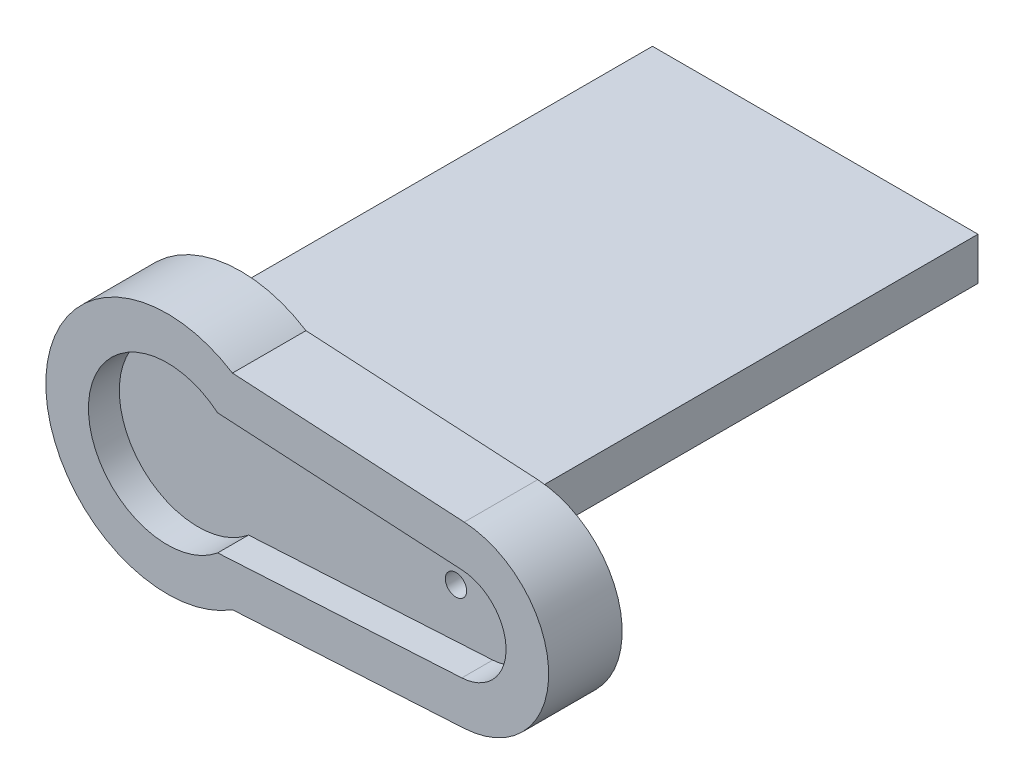
ISO-10303-21;
HEADER;
FILE_DESCRIPTION(('STEP AP214'),'2;1');
FILE_NAME('part.step','',(''),(''),'','','');
FILE_SCHEMA(('AUTOMOTIVE_DESIGN { 1 0 10303 214 1 1 1 1 }'));
ENDSEC;
DATA;
#1=APPLICATION_CONTEXT('core data for automotive mechanical design processes');
#2=APPLICATION_PROTOCOL_DEFINITION('international standard','automotive_design',2000,#1);
#3=PRODUCT_CONTEXT('',#1,'mechanical');
#4=PRODUCT('Part','Part','',(#3));
#5=PRODUCT_RELATED_PRODUCT_CATEGORY('part','',(#4));
#6=PRODUCT_DEFINITION_FORMATION('','',#4);
#7=PRODUCT_DEFINITION_CONTEXT('part definition',#1,'design');
#8=PRODUCT_DEFINITION('design','',#6,#7);
#9=PRODUCT_DEFINITION_SHAPE('','',#8);
#10=(LENGTH_UNIT() NAMED_UNIT(*) SI_UNIT(.MILLI.,.METRE.));
#11=(NAMED_UNIT(*) PLANE_ANGLE_UNIT() SI_UNIT($,.RADIAN.));
#12=(NAMED_UNIT(*) SI_UNIT($,.STERADIAN.) SOLID_ANGLE_UNIT());
#13=UNCERTAINTY_MEASURE_WITH_UNIT(LENGTH_MEASURE(1.E-05),#10,'distance_accuracy_value','');
#14=(GEOMETRIC_REPRESENTATION_CONTEXT(3) GLOBAL_UNCERTAINTY_ASSIGNED_CONTEXT((#13)) GLOBAL_UNIT_ASSIGNED_CONTEXT((#10,
#11,#12)) REPRESENTATION_CONTEXT('',''));
#15=CARTESIAN_POINT('',(0.,0.,0.));
#16=DIRECTION('',(0.,0.,1.));
#17=DIRECTION('',(1.,0.,0.));
#18=AXIS2_PLACEMENT_3D('',#15,#16,#17);
#19=CARTESIAN_POINT('',(13.7,0.,-3.45));
#20=DIRECTION('',(0.,0.,-1.));
#21=DIRECTION('',(-1.,0.,0.));
#22=AXIS2_PLACEMENT_3D('',#19,#20,#21);
#23=PLANE('',#22);
#24=CARTESIAN_POINT('',(0.,0.,-3.45));
#25=DIRECTION('',(0.,0.,-1.));
#26=DIRECTION('',(-1.,0.,0.));
#27=AXIS2_PLACEMENT_3D('',#24,#25,#26);
#28=CIRCLE('',#27,5.7);
#29=CARTESIAN_POINT('',(3.05879570208653,-4.80975767091202,-3.45));
#30=VERTEX_POINT('',#29);
#31=CARTESIAN_POINT('',(-3.49857113690718,-4.5,-3.45));
#32=VERTEX_POINT('',#31);
#33=EDGE_CURVE('E245',#30,#32,#28,.T.);
#34=ORIENTED_EDGE('',*,*,#33,.T.);
#35=CARTESIAN_POINT('',(10.3361249694973,-4.5,-3.45));
#36=CARTESIAN_POINT('',(4.93787519318368,-4.5,-3.45));
#37=CARTESIAN_POINT('',(-0.460374583129962,-4.5,-3.45));
#38=CARTESIAN_POINT('',(-5.8586243594436,-4.5,-3.45));
#39=(BOUNDED_CURVE() B_SPLINE_CURVE(3,(#35,#36,#37,#38),.UNSPECIFIED.,.F.,
.F.) B_SPLINE_CURVE_WITH_KNOTS((4,4),(-0.0103361249694973,0.0058586243594436),
.UNSPECIFIED.) CURVE() GEOMETRIC_REPRESENTATION_ITEM() RATIONAL_B_SPLINE_CURVE((1.,1.,1.,1.)) REPRESENTATION_ITEM(''));
#40=CARTESIAN_POINT('',(8.5249464707113,-4.5,-3.45));
#41=VERTEX_POINT('',#40);
#42=EDGE_CURVE('E73',#32,#41,#39,.F.);
#43=ORIENTED_EDGE('',*,*,#42,.T.);
#44=DIRECTION('',(-0.998398206670151,-0.0565775654992933,0.));
#45=VECTOR('',#44,1.);
#46=CARTESIAN_POINT('',(13.937625775097,-4.19327246801463,-3.45));
#47=LINE('',#46,#45);
#48=EDGE_CURVE('E235',#41,#30,#47,.T.);
#49=ORIENTED_EDGE('',*,*,#48,.T.);
#50=EDGE_LOOP('',(#34,#43,#49));
#51=FACE_BOUND('',#50,.T.);
#52=ADVANCED_FACE('F47',(#51),#23,.T.);
#53=CARTESIAN_POINT('',(12.1,0.,-3.45));
#54=DIRECTION('',(0.,0.,-1.));
#55=DIRECTION('',(-1.,0.,0.));
#56=AXIS2_PLACEMENT_3D('',#53,#54,#55);
#57=CIRCLE('',#56,0.500000000000001);
#58=CARTESIAN_POINT('',(11.6,0.,-3.45));
#59=VERTEX_POINT('',#58);
#60=EDGE_CURVE('E502',#59,#59,#57,.T.);
#61=ORIENTED_EDGE('',*,*,#60,.F.);
#62=EDGE_LOOP('',(#61));
#63=FACE_BOUND('',#62,.T.);
#64=CARTESIAN_POINT('',(13.937625775097,-4.19327246801463,-3.45));
#65=VERTEX_POINT('',#64);
#66=CARTESIAN_POINT('',(9.6,-4.43907850488691,-3.45));
#67=VERTEX_POINT('',#66);
#68=EDGE_CURVE('E224',#65,#67,#47,.T.);
#69=ORIENTED_EDGE('',*,*,#68,.T.);
#70=DIRECTION('',(0.,-1.,0.));
#71=VECTOR('',#70,1.);
#72=CARTESIAN_POINT('',(9.6,0.,-3.45));
#73=LINE('',#72,#71);
#74=CARTESIAN_POINT('',(9.6,-0.500000000000001,-3.45));
#75=VERTEX_POINT('',#74);
#76=EDGE_CURVE('E178',#75,#67,#73,.T.);
#77=ORIENTED_EDGE('',*,*,#76,.F.);
#78=DIRECTION('',(-1.,0.,0.));
#79=VECTOR('',#78,1.);
#80=CARTESIAN_POINT('',(0.,-0.500000000000001,-3.45));
#81=LINE('',#80,#79);
#82=CARTESIAN_POINT('',(-5.67802782663136,-0.500000000000001,-3.45));
#83=VERTEX_POINT('',#82);
#84=EDGE_CURVE('E161',#75,#83,#81,.T.);
#85=ORIENTED_EDGE('',*,*,#84,.T.);
#86=CARTESIAN_POINT('',(3.05879570208653,4.80975767091202,-3.45));
#87=VERTEX_POINT('',#86);
#88=EDGE_CURVE('E233',#83,#87,#28,.T.);
#89=ORIENTED_EDGE('',*,*,#88,.T.);
#90=DIRECTION('',(0.998398206670151,-0.0565775654992932,0.));
#91=VECTOR('',#90,1.);
#92=CARTESIAN_POINT('',(3.05879570208653,4.80975767091202,-3.45));
#93=LINE('',#92,#91);
#94=CARTESIAN_POINT('',(13.937625775097,4.19327246801463,-3.45));
#95=VERTEX_POINT('',#94);
#96=EDGE_CURVE('E246',#87,#95,#93,.T.);
#97=ORIENTED_EDGE('',*,*,#96,.T.);
#98=CARTESIAN_POINT('',(13.7,0.,-3.45));
#99=DIRECTION('',(0.,0.,-1.));
#100=DIRECTION('',(-1.,0.,0.));
#101=AXIS2_PLACEMENT_3D('',#98,#99,#100);
#102=CIRCLE('',#101,4.2);
#103=EDGE_CURVE('E240',#95,#65,#102,.T.);
#104=ORIENTED_EDGE('',*,*,#103,.T.);
#105=EDGE_LOOP('',(#69,#77,#85,#89,#97,#104));
#106=FACE_BOUND('',#105,.T.);
#107=ADVANCED_FACE('F253',(#63,#106),#23,.T.);
#108=CARTESIAN_POINT('',(0.281479761671259,-4.96714354508656,-27.6591587045445));
#109=DIRECTION('',(0.0565775654992933,-0.998398206670151,0.));
#110=DIRECTION('',(0.998398206670151,0.0565775654992933,0.));
#111=AXIS2_PLACEMENT_3D('',#108,#109,#110);
#112=PLANE('',#111);
#113=DIRECTION('',(0.,0.,1.));
#114=VECTOR('',#113,1.);
#115=CARTESIAN_POINT('',(3.05879570208653,-4.80975767091202,-27.6591587045445));
#116=LINE('',#115,#114);
#117=CARTESIAN_POINT('',(3.05879570208653,-4.80975767091202,0.));
#118=VERTEX_POINT('',#117);
#119=EDGE_CURVE('E470',#30,#118,#116,.T.);
#120=ORIENTED_EDGE('',*,*,#119,.F.);
#121=ORIENTED_EDGE('',*,*,#48,.F.);
#122=CARTESIAN_POINT('',(26.0199982000403,-3.50858452217087,-3.45));
#123=CARTESIAN_POINT('',(20.3112960784589,-3.83208717476614,-3.45000000000497));
#124=CARTESIAN_POINT('',(14.4183428523395,-4.16603103093047,-3.44999999999231));
#125=CARTESIAN_POINT('',(8.52494647071106,-4.50000000000001,-3.45));
#126=(BOUNDED_CURVE() B_SPLINE_CURVE(3,(#122,#123,#124,#125),.UNSPECIFIED.,.F.,
.F.) B_SPLINE_CURVE_WITH_KNOTS((4,4),(4.46151413081848,4.71238898038469),
.UNSPECIFIED.) CURVE() GEOMETRIC_REPRESENTATION_ITEM() RATIONAL_B_SPLINE_CURVE((1.,1.,1.,1.)) REPRESENTATION_ITEM(''));
#127=EDGE_CURVE('E234',#67,#41,#126,.T.);
#128=ORIENTED_EDGE('',*,*,#127,.F.);
#129=ORIENTED_EDGE('',*,*,#68,.F.);
#130=DIRECTION('',(0.,0.,1.));
#131=VECTOR('',#130,1.);
#132=CARTESIAN_POINT('',(13.937625775097,-4.19327246801463,-27.6591587045445));
#133=LINE('',#132,#131);
#134=CARTESIAN_POINT('',(13.937625775097,-4.19327246801463,0.));
#135=VERTEX_POINT('',#134);
#136=EDGE_CURVE('E473',#65,#135,#133,.T.);
#137=ORIENTED_EDGE('',*,*,#136,.T.);
#138=DIRECTION('',(0.998398206670151,0.0565775654992933,0.));
#139=VECTOR('',#138,1.);
#140=CARTESIAN_POINT('',(0.281479761671259,-4.96714354508656,0.));
#141=LINE('',#140,#139);
#142=EDGE_CURVE('E449',#118,#135,#141,.T.);
#143=ORIENTED_EDGE('',*,*,#142,.F.);
#144=EDGE_LOOP('',(#120,#121,#128,#129,#137,#143));
#145=FACE_BOUND('',#144,.T.);
#146=ADVANCED_FACE('F263',(#145),#112,.T.);
#147=CARTESIAN_POINT('',(0.,0.,-27.6591587045445));
#148=DIRECTION('',(0.,0.,1.));
#149=DIRECTION('',(1.,0.,0.));
#150=AXIS2_PLACEMENT_3D('',#147,#148,#149);
#151=CYLINDRICAL_SURFACE('',#150,5.7);
#152=DIRECTION('',(0.,0.,1.));
#153=VECTOR('',#152,1.);
#154=CARTESIAN_POINT('',(3.05879570208653,4.80975767091202,-27.6591587045445));
#155=LINE('',#154,#153);
#156=CARTESIAN_POINT('',(3.05879570208653,4.80975767091202,0.));
#157=VERTEX_POINT('',#156);
#158=EDGE_CURVE('E472',#87,#157,#155,.T.);
#159=ORIENTED_EDGE('',*,*,#158,.F.);
#160=ORIENTED_EDGE('',*,*,#88,.F.);
#161=DIRECTION('',(0.,0.,1.));
#162=VECTOR('',#161,1.);
#163=CARTESIAN_POINT('',(-5.67802782663136,-0.500000000000001,-28.45));
#164=LINE('',#163,#162);
#165=CARTESIAN_POINT('',(-5.67802782663136,-0.500000000000001,-28.45));
#166=VERTEX_POINT('',#165);
#167=EDGE_CURVE('E183',#166,#83,#164,.T.);
#168=ORIENTED_EDGE('',*,*,#167,.F.);
#169=CARTESIAN_POINT('',(0.,0.,-28.45));
#170=DIRECTION('',(0.,0.,-1.));
#171=DIRECTION('',(-1.,0.,0.));
#172=AXIS2_PLACEMENT_3D('',#169,#170,#171);
#173=CIRCLE('',#172,5.7);
#174=CARTESIAN_POINT('',(-5.12249938994628,-2.5,-28.45));
#175=VERTEX_POINT('',#174);
#176=EDGE_CURVE('E176',#175,#166,#173,.T.);
#177=ORIENTED_EDGE('',*,*,#176,.F.);
#178=DIRECTION('',(0.,0.,1.));
#179=VECTOR('',#178,1.);
#180=CARTESIAN_POINT('',(-5.12249938994628,-2.5,-28.45));
#181=LINE('',#180,#179);
#182=CARTESIAN_POINT('',(-5.12249938994628,-2.5,-7.45));
#183=VERTEX_POINT('',#182);
#184=EDGE_CURVE('E187',#175,#183,#181,.T.);
#185=ORIENTED_EDGE('',*,*,#184,.T.);
#186=CARTESIAN_POINT('',(-3.49857113690718,-4.5,-3.45));
#187=CARTESIAN_POINT('',(-3.52135943787437,-4.48228363573835,-3.44999948683764));
#188=CARTESIAN_POINT('',(-3.54401423918639,-4.46439235067978,-3.45047079923122));
#189=CARTESIAN_POINT('',(-3.58879068390615,-4.42847546557835,-3.45239903165103));
#190=CARTESIAN_POINT('',(-3.61091541746685,-4.4104531629488,-3.45384571851635));
#191=CARTESIAN_POINT('',(-3.65463223410442,-4.37429249923195,-3.45774628032758));
#192=CARTESIAN_POINT('',(-3.67622736446166,-4.35615680342029,-3.4601906011542));
#193=CARTESIAN_POINT('',(-3.71888486401768,-4.31978995756124,-3.46610523534313));
#194=CARTESIAN_POINT('',(-3.73995016437916,-4.30156084219657,-3.46956688330219));
#195=CARTESIAN_POINT('',(-3.78154815274437,-4.26502816186722,-3.47753303536169));
#196=CARTESIAN_POINT('',(-3.80208356188589,-4.24672604655598,-3.48202995370039));
#197=CARTESIAN_POINT('',(-3.84262196070537,-4.21006918291325,-3.49208117774168));
#198=CARTESIAN_POINT('',(-3.8626273603044,-4.19171536704128,-3.49762915127449));
#199=CARTESIAN_POINT('',(-3.90210604627234,-4.15497750999087,-3.50979463806932));
#200=CARTESIAN_POINT('',(-3.9215813248629,-4.136593978059,-3.51640721708021));
#201=CARTESIAN_POINT('',(-3.96000017694947,-4.09981962699013,-3.53071157385417));
#202=CARTESIAN_POINT('',(-3.97894521923598,-4.08142900937855,-3.53839992164791));
#203=CARTESIAN_POINT('',(-4.01630411161582,-4.04466384827798,-3.55486290905928));
#204=CARTESIAN_POINT('',(-4.03471880814064,-4.02628933042866,-3.56363568415547));
#205=CARTESIAN_POINT('',(-4.07101761850538,-3.98958005769205,-3.58227199274478));
#206=CARTESIAN_POINT('',(-4.08890187062064,-3.9712452936177,-3.5921352387494));
#207=CARTESIAN_POINT('',(-4.12414048294043,-3.9346394474504,-3.6129542872671));
#208=CARTESIAN_POINT('',(-4.14149420639569,-3.91636846352998,-3.62391134014705));
#209=CARTESIAN_POINT('',(-4.1756725205914,-3.87991423499469,-3.64691710312674));
#210=CARTESIAN_POINT('',(-4.19249565632049,-3.86173133083836,-3.65896851375919));
#211=CARTESIAN_POINT('',(-4.22561357350078,-3.8254773644799,-3.68415938308699));
#212=CARTESIAN_POINT('',(-4.24190606506489,-3.80740700482203,-3.69730286175649));
#213=CARTESIAN_POINT('',(-4.27396355962951,-3.77140220517301,-3.72467153034962));
#214=CARTESIAN_POINT('',(-4.28972544953139,-3.75346892798487,-3.73890189396283));
#215=CARTESIAN_POINT('',(-4.32072231040284,-3.71776220938578,-3.7684353167023));
#216=CARTESIAN_POINT('',(-4.33595338183049,-3.69999046248252,-3.78374451267727));
#217=CARTESIAN_POINT('',(-4.36589019282331,-3.66463068730988,-3.8154237440113));
#218=CARTESIAN_POINT('',(-4.38059131649149,-3.6470449290672,-3.83180067324838));
#219=CARTESIAN_POINT('',(-4.4076404189942,-3.61429047462847,-3.86346458076737));
#220=CARTESIAN_POINT('',(-4.4200604726872,-3.59908281977482,-3.87864992191386));
#221=CARTESIAN_POINT('',(-4.44456187565487,-3.5687640214606,-3.90989035449492));
#222=CARTESIAN_POINT('',(-4.45663681106162,-3.55365663721468,-3.92595412256079));
#223=CARTESIAN_POINT('',(-4.48044886830033,-3.52355635651603,-3.95895067293352));
#224=CARTESIAN_POINT('',(-4.49217921495446,-3.50856777001826,-3.97589226850495));
#225=CARTESIAN_POINT('',(-4.51530229664353,-3.47872274293737,-4.0106424414715));
#226=CARTESIAN_POINT('',(-4.52668795952674,-3.46387112866165,-4.02845986331896));
#227=CARTESIAN_POINT('',(-4.54912197464317,-3.43431801521196,-4.0649576791176));
#228=CARTESIAN_POINT('',(-4.56016303532294,-3.41962182110094,-4.08364684353155));
#229=CARTESIAN_POINT('',(-4.58190802529763,-3.39039759465401,-4.12188227161862));
#230=CARTESIAN_POINT('',(-4.59260451840861,-3.37587529579871,-4.14143713955357));
#231=CARTESIAN_POINT('',(-4.61366050040086,-3.34701696681249,-4.18139616911346));
#232=CARTESIAN_POINT('',(-4.62401248243199,-3.33268704086221,-4.20180868818209));
#233=CARTESIAN_POINT('',(-4.64437946479709,-3.30423159420291,-4.24347318205763));
#234=CARTESIAN_POINT('',(-4.65438695718618,-3.29011248544658,-4.26473319849983));
#235=CARTESIAN_POINT('',(-4.67406503396775,-3.2620966113214,-4.30808108730622));
#236=CARTESIAN_POINT('',(-4.68372817625725,-3.248206496768,-4.33017663370166));
#237=CARTESIAN_POINT('',(-4.70271711866717,-3.22066692010836,-4.37518107075887));
#238=CARTESIAN_POINT('',(-4.71203559491956,-3.20702428696851,-4.39809721106992));
#239=CARTESIAN_POINT('',(-4.73968894732184,-3.16618312078885,-4.46856104459499));
#240=CARTESIAN_POINT('',(-4.75727281366847,-3.13971267698147,-4.51683007642658));
#241=CARTESIAN_POINT('',(-4.79111624058115,-3.08791840318486,-4.61637821674387));
#242=CARTESIAN_POINT('',(-4.80732257495405,-3.06265012473153,-4.66770402617602));
#243=CARTESIAN_POINT('',(-4.83840691642536,-3.01338825911101,-4.77319369964655));
#244=CARTESIAN_POINT('',(-4.85323658327684,-2.98944830140428,-4.82739678993885));
#245=CARTESIAN_POINT('',(-4.8788392251918,-2.94744616326464,-4.9277333688091));
#246=CARTESIAN_POINT('',(-4.88987331359836,-2.92907650353586,-4.97367277902174));
#247=CARTESIAN_POINT('',(-4.91119598321023,-2.89315050254008,-5.06761978066066));
#248=CARTESIAN_POINT('',(-4.92145416220228,-2.87563252266421,-5.11564892294028));
#249=CARTESIAN_POINT('',(-4.94122044480173,-2.84149787668658,-5.21367593692733));
#250=CARTESIAN_POINT('',(-4.95070109672334,-2.82491792218674,-5.2636920825888));
#251=CARTESIAN_POINT('',(-4.9689098888579,-2.79274358411116,-5.36557643192522));
#252=CARTESIAN_POINT('',(-4.97761363750965,-2.77718368966192,-5.4174598566952));
#253=CARTESIAN_POINT('',(-4.99426558332823,-2.74712917454092,-5.52294451293307));
#254=CARTESIAN_POINT('',(-5.00219241268835,-2.7326663406733,-5.5765581496519));
#255=CARTESIAN_POINT('',(-5.01728754077378,-2.70487985466643,-5.68535264993631));
#256=CARTESIAN_POINT('',(-5.02443742592218,-2.69158488665574,-5.74054337359176));
#257=CARTESIAN_POINT('',(-5.03797630309332,-2.66620098933783,-5.85232701838367));
#258=CARTESIAN_POINT('',(-5.04434974142817,-2.65413731730776,-5.90892755035162));
#259=CARTESIAN_POINT('',(-5.0563312333926,-2.6312755490794,-6.02335101379642));
#260=CARTESIAN_POINT('',(-5.06192643364868,-2.62049904635201,-6.08117957646416));
#261=CARTESIAN_POINT('',(-5.0764871858025,-2.59224256319139,-6.24410318759367));
#262=CARTESIAN_POINT('',(-5.08451506546112,-2.5763968947113,-6.34957010528066));
#263=CARTESIAN_POINT('',(-5.09834011827781,-2.54889070245195,-6.56386944240777));
#264=CARTESIAN_POINT('',(-5.10407666461315,-2.53734441154954,-6.67272019692379));
#265=CARTESIAN_POINT('',(-5.11329624001476,-2.51871977611599,-6.89255721886073));
#266=CARTESIAN_POINT('',(-5.11674388380899,-2.51171162784039,-7.00355089008488));
#267=CARTESIAN_POINT('',(-5.121343121078,-2.50234475598757,-7.2263641743709));
#268=CARTESIAN_POINT('',(-5.12248261932482,-2.50001052557208,-7.33818507217445));
#269=CARTESIAN_POINT('',(-5.12249938994628,-2.5,-7.45));
#270=B_SPLINE_CURVE_WITH_KNOTS('',3,(#186,#187,#188,#189,#190,#191,#192,#193,#194,#195,#196,
#197,#198,#199,#200,#201,#202,#203,#204,#205,#206,#207,#208,#209,#210,#211,#212,#213,#214,#215,
#216,#217,#218,#219,#220,#221,#222,#223,#224,#225,#226,#227,#228,#229,#230,#231,#232,#233,#234,
#235,#236,#237,#238,#239,#240,#241,#242,#243,#244,#245,#246,#247,#248,#249,#250,#251,#252,#253,
#254,#255,#256,#257,#258,#259,#260,#261,#262,#263,#264,#265,#266,#267,#268,#269),.UNSPECIFIED.,
.F.,.F.,(4,2,2,2,2,2,2,2,2,2,2,2,2,2,2,2,2,2,2,2,2,2,2,2,2,2,2,2,2,2,2,2,2,2,2,2,2,2,2,2,2,4),
(0.,0.0865925618069848,0.172290488400818,0.257186274513799,0.341378916044447,0.42497325156892,
0.508079120709701,0.590810347125319,0.673283562889088,0.755616899955024,0.837928582433963,
0.920335459703728,1.00295152427878,1.0858864594488,1.16924425987529,1.25312196386569,
1.33760852947103,1.41205843791821,1.48746623655902,1.56389363445246,1.64139633828805,
1.72002361068706,1.79981790457272,1.880814573873,1.96304165928107,2.04651974660696,
2.13126189438534,2.30453639798272,2.4828383229152,2.66600776902151,2.81804828983421,
2.97444327107608,3.13502745162891,3.29958075373295,3.46783099943733,3.63945754336396,
3.81409576524253,3.99134234245802,4.31205418449696,4.64076453508879,4.97444507202668,
5.30986969675646),.UNSPECIFIED.);
#271=EDGE_CURVE('E59',#183,#32,#270,.F.);
#272=ORIENTED_EDGE('',*,*,#271,.T.);
#273=ORIENTED_EDGE('',*,*,#33,.F.);
#274=ORIENTED_EDGE('',*,*,#119,.T.);
#275=CARTESIAN_POINT('',(0.,0.,0.));
#276=DIRECTION('',(0.,0.,1.));
#277=DIRECTION('',(1.,0.,0.));
#278=AXIS2_PLACEMENT_3D('',#275,#276,#277);
#279=CIRCLE('',#278,5.7);
#280=EDGE_CURVE('E437',#157,#118,#279,.T.);
#281=ORIENTED_EDGE('',*,*,#280,.F.);
#282=EDGE_LOOP('',(#159,#160,#168,#177,#185,#272,#273,#274,#281));
#283=FACE_BOUND('',#282,.T.);
#284=ADVANCED_FACE('F297',(#283),#151,.T.);
#285=CARTESIAN_POINT('',(0.28147976167126,4.96714354508656,-27.6591587045445));
#286=DIRECTION('',(0.0565775654992934,0.998398206670151,0.));
#287=DIRECTION('',(-0.998398206670151,0.0565775654992934,0.));
#288=AXIS2_PLACEMENT_3D('',#285,#286,#287);
#289=PLANE('',#288);
#290=DIRECTION('',(0.,0.,1.));
#291=VECTOR('',#290,1.);
#292=CARTESIAN_POINT('',(13.937625775097,4.19327246801463,-27.6591587045445));
#293=LINE('',#292,#291);
#294=CARTESIAN_POINT('',(13.937625775097,4.19327246801463,0.));
#295=VERTEX_POINT('',#294);
#296=EDGE_CURVE('E451',#95,#295,#293,.T.);
#297=ORIENTED_EDGE('',*,*,#296,.F.);
#298=ORIENTED_EDGE('',*,*,#96,.F.);
#299=ORIENTED_EDGE('',*,*,#158,.T.);
#300=DIRECTION('',(-0.998398206670151,0.0565775654992934,0.));
#301=VECTOR('',#300,1.);
#302=CARTESIAN_POINT('',(0.28147976167126,4.96714354508656,0.));
#303=LINE('',#302,#301);
#304=EDGE_CURVE('E439',#295,#157,#303,.T.);
#305=ORIENTED_EDGE('',*,*,#304,.F.);
#306=EDGE_LOOP('',(#297,#298,#299,#305));
#307=FACE_BOUND('',#306,.T.);
#308=ADVANCED_FACE('F290',(#307),#289,.T.);
#309=CARTESIAN_POINT('',(0.,0.,-27.6591587045445));
#310=DIRECTION('',(0.,0.,1.));
#311=DIRECTION('',(1.,0.,0.));
#312=AXIS2_PLACEMENT_3D('',#309,#310,#311);
#313=CYLINDRICAL_SURFACE('',#312,3.7);
#314=DIRECTION('',(0.,0.,1.));
#315=VECTOR('',#314,1.);
#316=CARTESIAN_POINT('',(2.36450675894932,-2.84589314396781,-27.6591587045445));
#317=LINE('',#316,#315);
#318=CARTESIAN_POINT('',(2.36450675894932,-2.84589314396781,-1.45));
#319=VERTEX_POINT('',#318);
#320=CARTESIAN_POINT('',(2.36450675894932,-2.84589314396781,0.));
#321=VERTEX_POINT('',#320);
#322=EDGE_CURVE('E456',#319,#321,#317,.T.);
#323=ORIENTED_EDGE('',*,*,#322,.F.);
#324=CARTESIAN_POINT('',(0.,0.,-1.45));
#325=DIRECTION('',(0.,0.,1.));
#326=DIRECTION('',(1.,0.,0.));
#327=AXIS2_PLACEMENT_3D('',#324,#325,#326);
#328=CIRCLE('',#327,3.7);
#329=CARTESIAN_POINT('',(2.36450675894932,2.84589314396781,-1.45));
#330=VERTEX_POINT('',#329);
#331=EDGE_CURVE('E475',#319,#330,#328,.F.);
#332=ORIENTED_EDGE('',*,*,#331,.T.);
#333=DIRECTION('',(0.,0.,1.));
#334=VECTOR('',#333,1.);
#335=CARTESIAN_POINT('',(2.36450675894932,2.84589314396781,-27.6591587045445));
#336=LINE('',#335,#334);
#337=CARTESIAN_POINT('',(2.36450675894932,2.84589314396781,0.));
#338=VERTEX_POINT('',#337);
#339=EDGE_CURVE('E469',#330,#338,#336,.T.);
#340=ORIENTED_EDGE('',*,*,#339,.T.);
#341=CARTESIAN_POINT('',(0.,0.,0.));
#342=DIRECTION('',(0.,0.,1.));
#343=DIRECTION('',(1.,0.,0.));
#344=AXIS2_PLACEMENT_3D('',#341,#342,#343);
#345=CIRCLE('',#344,3.7);
#346=EDGE_CURVE('E465',#338,#321,#345,.T.);
#347=ORIENTED_EDGE('',*,*,#346,.T.);
#348=EDGE_LOOP('',(#323,#332,#340,#347));
#349=FACE_BOUND('',#348,.T.);
#350=ADVANCED_FACE('F286',(#349),#313,.F.);
#351=CARTESIAN_POINT('',(0.168324630672673,-2.97034713174626,-27.6591587045445));
#352=DIRECTION('',(0.0565775654992933,-0.998398206670151,0.));
#353=DIRECTION('',(0.998398206670151,0.0565775654992933,0.));
#354=AXIS2_PLACEMENT_3D('',#351,#352,#353);
#355=PLANE('',#354);
#356=DIRECTION('',(0.,0.,1.));
#357=VECTOR('',#356,1.);
#358=CARTESIAN_POINT('',(13.8244706440984,-2.19647605467433,-27.6591587045445));
#359=LINE('',#358,#357);
#360=CARTESIAN_POINT('',(13.8244706440984,-2.19647605467433,-1.45));
#361=VERTEX_POINT('',#360);
#362=CARTESIAN_POINT('',(13.8244706440984,-2.19647605467433,0.));
#363=VERTEX_POINT('',#362);
#364=EDGE_CURVE('E460',#361,#363,#359,.T.);
#365=ORIENTED_EDGE('',*,*,#364,.F.);
#366=DIRECTION('',(-0.998398206670151,-0.0565775654992933,0.));
#367=VECTOR('',#366,1.);
#368=CARTESIAN_POINT('',(0.168324630672673,-2.97034713174626,-1.45));
#369=LINE('',#368,#367);
#370=EDGE_CURVE('E468',#361,#319,#369,.T.);
#371=ORIENTED_EDGE('',*,*,#370,.T.);
#372=ORIENTED_EDGE('',*,*,#322,.T.);
#373=DIRECTION('',(0.998398206670151,0.0565775654992933,0.));
#374=VECTOR('',#373,1.);
#375=CARTESIAN_POINT('',(0.168324630672673,-2.97034713174626,0.));
#376=LINE('',#375,#374);
#377=EDGE_CURVE('E452',#321,#363,#376,.T.);
#378=ORIENTED_EDGE('',*,*,#377,.T.);
#379=EDGE_LOOP('',(#365,#371,#372,#378));
#380=FACE_BOUND('',#379,.T.);
#381=ADVANCED_FACE('F282',(#380),#355,.F.);
#382=CARTESIAN_POINT('',(13.7,0.,-27.6591587045445));
#383=DIRECTION('',(0.,0.,1.));
#384=DIRECTION('',(1.,0.,0.));
#385=AXIS2_PLACEMENT_3D('',#382,#383,#384);
#386=CYLINDRICAL_SURFACE('',#385,2.2);
#387=DIRECTION('',(0.,0.,1.));
#388=VECTOR('',#387,1.);
#389=CARTESIAN_POINT('',(13.8244706440984,2.19647605467433,-27.6591587045445));
#390=LINE('',#389,#388);
#391=CARTESIAN_POINT('',(13.8244706440984,2.19647605467433,-1.45000000000001));
#392=VERTEX_POINT('',#391);
#393=CARTESIAN_POINT('',(13.8244706440984,2.19647605467433,0.));
#394=VERTEX_POINT('',#393);
#395=EDGE_CURVE('E464',#392,#394,#390,.T.);
#396=ORIENTED_EDGE('',*,*,#395,.F.);
#397=CARTESIAN_POINT('',(13.7,0.,-1.45));
#398=DIRECTION('',(0.,0.,1.));
#399=DIRECTION('',(1.,0.,0.));
#400=AXIS2_PLACEMENT_3D('',#397,#398,#399);
#401=CIRCLE('',#400,2.2);
#402=EDGE_CURVE('E455',#392,#361,#401,.F.);
#403=ORIENTED_EDGE('',*,*,#402,.T.);
#404=ORIENTED_EDGE('',*,*,#364,.T.);
#405=CARTESIAN_POINT('',(13.7,0.,0.));
#406=DIRECTION('',(0.,0.,1.));
#407=DIRECTION('',(1.,0.,0.));
#408=AXIS2_PLACEMENT_3D('',#405,#406,#407);
#409=CIRCLE('',#408,2.2);
#410=EDGE_CURVE('E457',#363,#394,#409,.T.);
#411=ORIENTED_EDGE('',*,*,#410,.T.);
#412=EDGE_LOOP('',(#396,#403,#404,#411));
#413=FACE_BOUND('',#412,.T.);
#414=ADVANCED_FACE('F278',(#413),#386,.F.);
#415=CARTESIAN_POINT('',(0.168324630672673,2.97034713174626,-27.6591587045445));
#416=DIRECTION('',(0.0565775654992934,0.998398206670151,0.));
#417=DIRECTION('',(-0.998398206670151,0.0565775654992934,0.));
#418=AXIS2_PLACEMENT_3D('',#415,#416,#417);
#419=PLANE('',#418);
#420=ORIENTED_EDGE('',*,*,#339,.F.);
#421=DIRECTION('',(0.998398206670151,-0.0565775654992934,0.));
#422=VECTOR('',#421,1.);
#423=CARTESIAN_POINT('',(0.168324630672673,2.97034713174626,-1.45));
#424=LINE('',#423,#422);
#425=EDGE_CURVE('E194',#330,#392,#424,.T.);
#426=ORIENTED_EDGE('',*,*,#425,.T.);
#427=ORIENTED_EDGE('',*,*,#395,.T.);
#428=DIRECTION('',(-0.998398206670151,0.0565775654992934,0.));
#429=VECTOR('',#428,1.);
#430=CARTESIAN_POINT('',(0.168324630672673,2.97034713174626,0.));
#431=LINE('',#430,#429);
#432=EDGE_CURVE('E461',#394,#338,#431,.T.);
#433=ORIENTED_EDGE('',*,*,#432,.T.);
#434=EDGE_LOOP('',(#420,#426,#427,#433));
#435=FACE_BOUND('',#434,.T.);
#436=ADVANCED_FACE('F275',(#435),#419,.F.);
#437=CARTESIAN_POINT('',(13.7,0.,-27.6591587045445));
#438=DIRECTION('',(0.,0.,1.));
#439=DIRECTION('',(1.,0.,0.));
#440=AXIS2_PLACEMENT_3D('',#437,#438,#439);
#441=CYLINDRICAL_SURFACE('',#440,4.2);
#442=ORIENTED_EDGE('',*,*,#136,.F.);
#443=ORIENTED_EDGE('',*,*,#103,.F.);
#444=ORIENTED_EDGE('',*,*,#296,.T.);
#445=CARTESIAN_POINT('',(13.7,0.,0.));
#446=DIRECTION('',(0.,0.,1.));
#447=DIRECTION('',(1.,0.,0.));
#448=AXIS2_PLACEMENT_3D('',#445,#446,#447);
#449=CIRCLE('',#448,4.2);
#450=EDGE_CURVE('E444',#135,#295,#449,.T.);
#451=ORIENTED_EDGE('',*,*,#450,.F.);
#452=EDGE_LOOP('',(#442,#443,#444,#451));
#453=FACE_BOUND('',#452,.T.);
#454=ADVANCED_FACE('F273',(#453),#441,.T.);
#455=CARTESIAN_POINT('',(0.,0.,0.));
#456=DIRECTION('',(0.,0.,1.));
#457=DIRECTION('',(1.,0.,0.));
#458=AXIS2_PLACEMENT_3D('',#455,#456,#457);
#459=PLANE('',#458);
#460=ORIENTED_EDGE('',*,*,#346,.F.);
#461=ORIENTED_EDGE('',*,*,#432,.F.);
#462=ORIENTED_EDGE('',*,*,#410,.F.);
#463=ORIENTED_EDGE('',*,*,#377,.F.);
#464=EDGE_LOOP('',(#460,#461,#462,#463));
#465=FACE_BOUND('',#464,.T.);
#466=ORIENTED_EDGE('',*,*,#142,.T.);
#467=ORIENTED_EDGE('',*,*,#450,.T.);
#468=ORIENTED_EDGE('',*,*,#304,.T.);
#469=ORIENTED_EDGE('',*,*,#280,.T.);
#470=EDGE_LOOP('',(#466,#467,#468,#469));
#471=FACE_BOUND('',#470,.T.);
#472=ADVANCED_FACE('F269',(#465,#471),#459,.T.);
#473=CARTESIAN_POINT('',(13.7,0.,-1.45));
#474=DIRECTION('',(0.,0.,-1.));
#475=DIRECTION('',(-1.,0.,0.));
#476=AXIS2_PLACEMENT_3D('',#473,#474,#475);
#477=PLANE('',#476);
#478=CARTESIAN_POINT('',(12.1,0.,-1.45));
#479=DIRECTION('',(0.,0.,-1.));
#480=DIRECTION('',(-1.,0.,0.));
#481=AXIS2_PLACEMENT_3D('',#478,#479,#480);
#482=CIRCLE('',#481,0.500000000000001);
#483=CARTESIAN_POINT('',(11.6,0.,-1.45));
#484=VERTEX_POINT('',#483);
#485=EDGE_CURVE('E163',#484,#484,#482,.T.);
#486=ORIENTED_EDGE('',*,*,#485,.T.);
#487=EDGE_LOOP('',(#486));
#488=FACE_BOUND('',#487,.T.);
#489=ORIENTED_EDGE('',*,*,#370,.F.);
#490=ORIENTED_EDGE('',*,*,#402,.F.);
#491=ORIENTED_EDGE('',*,*,#425,.F.);
#492=ORIENTED_EDGE('',*,*,#331,.F.);
#493=EDGE_LOOP('',(#489,#490,#491,#492));
#494=FACE_BOUND('',#493,.T.);
#495=ADVANCED_FACE('F266',(#488,#494),#477,.F.);
#496=CARTESIAN_POINT('',(12.1,0.,-3.45));
#497=DIRECTION('',(0.,0.,1.));
#498=DIRECTION('',(1.,0.,0.));
#499=AXIS2_PLACEMENT_3D('',#496,#497,#498);
#500=CYLINDRICAL_SURFACE('',#499,0.500000000000001);
#501=ORIENTED_EDGE('',*,*,#60,.T.);
#502=EDGE_LOOP('',(#501));
#503=FACE_BOUND('',#502,.T.);
#504=ORIENTED_EDGE('',*,*,#485,.F.);
#505=EDGE_LOOP('',(#504));
#506=FACE_BOUND('',#505,.T.);
#507=ADVANCED_FACE('F265',(#503,#506),#500,.F.);
#508=CARTESIAN_POINT('',(0.,-0.500000000000001,-28.45));
#509=DIRECTION('',(0.,1.,0.));
#510=DIRECTION('',(-1.,0.,0.));
#511=AXIS2_PLACEMENT_3D('',#508,#509,#510);
#512=PLANE('',#511);
#513=ORIENTED_EDGE('',*,*,#84,.F.);
#514=DIRECTION('',(0.,0.,1.));
#515=VECTOR('',#514,1.);
#516=CARTESIAN_POINT('',(9.6,-0.500000000000001,-28.45));
#517=LINE('',#516,#515);
#518=CARTESIAN_POINT('',(9.6,-0.500000000000001,-28.45));
#519=VERTEX_POINT('',#518);
#520=EDGE_CURVE('E155',#519,#75,#517,.T.);
#521=ORIENTED_EDGE('',*,*,#520,.F.);
#522=DIRECTION('',(-1.,0.,0.));
#523=VECTOR('',#522,1.);
#524=CARTESIAN_POINT('',(0.,-0.500000000000001,-28.45));
#525=LINE('',#524,#523);
#526=EDGE_CURVE('E160',#519,#166,#525,.T.);
#527=ORIENTED_EDGE('',*,*,#526,.T.);
#528=ORIENTED_EDGE('',*,*,#167,.T.);
#529=EDGE_LOOP('',(#513,#521,#527,#528));
#530=FACE_BOUND('',#529,.T.);
#531=ADVANCED_FACE('F157',(#530),#512,.T.);
#532=CARTESIAN_POINT('',(9.6,0.,-28.45));
#533=DIRECTION('',(-1.,0.,0.));
#534=DIRECTION('',(0.,0.,1.));
#535=AXIS2_PLACEMENT_3D('',#532,#533,#534);
#536=PLANE('',#535);
#537=ORIENTED_EDGE('',*,*,#76,.T.);
#538=CARTESIAN_POINT('',(9.60000000000002,-2.5,-7.44953539575042));
#539=CARTESIAN_POINT('',(9.59997246434453,-2.50001633842666,-7.32976985401155));
#540=CARTESIAN_POINT('',(9.59994351036427,-2.50260872579677,-7.20999846997606));
#541=CARTESIAN_POINT('',(9.59988296487057,-2.51320545452559,-6.96758997223212));
#542=CARTESIAN_POINT('',(9.59985132448869,-2.52134812890497,-6.84495891827859));
#543=CARTESIAN_POINT('',(9.59978664847069,-2.54348664419975,-6.59835842787637));
#544=CARTESIAN_POINT('',(9.5997535989953,-2.55756882376743,-6.47439666399274));
#545=CARTESIAN_POINT('',(9.59968754949095,-2.59193517984094,-6.22690188442302));
#546=CARTESIAN_POINT('',(9.59965455001296,-2.61224029795705,-6.10337176314745));
#547=CARTESIAN_POINT('',(9.59959021560746,-2.65924750529152,-5.85866553827902));
#548=CARTESIAN_POINT('',(9.59955886838537,-2.68589046179673,-5.7374782561213));
#549=CARTESIAN_POINT('',(9.5995141404873,-2.73094115375964,-5.55793147093044));
#550=CARTESIAN_POINT('',(9.59949971366254,-2.74666864778429,-5.49889159303234));
#551=CARTESIAN_POINT('',(9.59947193055382,-2.7796980414695,-5.38216627185214));
#552=CARTESIAN_POINT('',(9.59945856187166,-2.79697408892062,-5.32447355357697));
#553=CARTESIAN_POINT('',(9.59943311223951,-2.83306589419494,-5.21069649416121));
#554=CARTESIAN_POINT('',(9.59942101264927,-2.85184889240383,-5.1546017784285));
#555=CARTESIAN_POINT('',(9.59939831485759,-2.89090911404898,-5.04426576824872));
#556=CARTESIAN_POINT('',(9.59938769032651,-2.91114636101015,-4.99001035992266));
#557=CARTESIAN_POINT('',(9.5993681492675,-2.95305715520756,-4.88358862435946));
#558=CARTESIAN_POINT('',(9.59935919725328,-2.97468332970689,-4.83140368989222));
#559=CARTESIAN_POINT('',(9.59934319827425,-3.01930266826364,-4.72934531829287));
#560=CARTESIAN_POINT('',(9.59933610520599,-3.04224100398278,-4.67944797805203));
#561=CARTESIAN_POINT('',(9.59932400895872,-3.08940460900387,-4.58217119515386));
#562=CARTESIAN_POINT('',(9.59931894766706,-3.11356770535991,-4.53476169913718));
#563=CARTESIAN_POINT('',(9.59931108521493,-3.16309089102501,-4.44264843909276));
#564=CARTESIAN_POINT('',(9.59930821268272,-3.18838178827859,-4.39790758971207));
#565=CARTESIAN_POINT('',(9.59930488121161,-3.24006215156047,-4.31129815094294));
#566=CARTESIAN_POINT('',(9.59930433663175,-3.26637598184273,-4.26938459274125));
#567=CARTESIAN_POINT('',(9.59930579583148,-3.31999523756149,-4.18857474879878));
#568=CARTESIAN_POINT('',(9.59930769905201,-3.34721951905188,-4.14962476798425));
#569=CARTESIAN_POINT('',(9.5993141682555,-3.40254968821639,-4.07485822483264));
#570=CARTESIAN_POINT('',(9.59931861862148,-3.43057004865376,-4.03897878833155));
#571=CARTESIAN_POINT('',(9.59932745947872,-3.47364758831504,-3.98700960038234));
#572=CARTESIAN_POINT('',(9.59933069364557,-3.4879251412369,-3.97027017383746));
#573=CARTESIAN_POINT('',(9.59933784416928,-3.51664430306164,-3.93759951858229));
#574=CARTESIAN_POINT('',(9.59934174336723,-3.531074824283,-3.92165856905365));
#575=CARTESIAN_POINT('',(9.59935023063734,-3.56008394534491,-3.89059237243927));
#576=CARTESIAN_POINT('',(9.59935480076849,-3.57465147359886,-3.8754567937349));
#577=CARTESIAN_POINT('',(9.59936463558534,-3.60391918569078,-3.84600665827786));
#578=CARTESIAN_POINT('',(9.59936988161373,-3.61860837623359,-3.83168118954523));
#579=CARTESIAN_POINT('',(9.59938107234614,-3.64810376432386,-3.8038550942289));
#580=CARTESIAN_POINT('',(9.59938699777193,-3.6628991323318,-3.79034300117159));
#581=CARTESIAN_POINT('',(9.5993995500037,-3.69259125806689,-3.76414581534037));
#582=CARTESIAN_POINT('',(9.59940615702023,-3.70747743416584,-3.75144874333489));
#583=CARTESIAN_POINT('',(9.59942007369018,-3.73733557824597,-3.72688215974307));
#584=CARTESIAN_POINT('',(9.59942736317089,-3.75229729991506,-3.71500020971098));
#585=CARTESIAN_POINT('',(9.59944264459936,-3.78229101420293,-3.6920628445329));
#586=CARTESIAN_POINT('',(9.59945061613541,-3.79731318293315,-3.68099459908137));
#587=CARTESIAN_POINT('',(9.59946726009329,-3.82741238686468,-3.65968206433693));
#588=CARTESIAN_POINT('',(9.59947591202363,-3.84248010550246,-3.64942463397187));
#589=CARTESIAN_POINT('',(9.59949391380288,-3.8726551656477,-3.62972963145489));
#590=CARTESIAN_POINT('',(9.59950324325202,-3.88775377786104,-3.62027870210814));
#591=CARTESIAN_POINT('',(9.59952259574726,-3.91797558603642,-3.60219112483994));
#592=CARTESIAN_POINT('',(9.5995325986656,-3.93309071211621,-3.59354101083126));
#593=CARTESIAN_POINT('',(9.59955329246275,-3.96333075774286,-3.5770480543175));
#594=CARTESIAN_POINT('',(9.59956396367049,-3.97844832819178,-3.56919175495222));
#595=CARTESIAN_POINT('',(9.59958598714325,-4.00867876577729,-3.55427803631674));
#596=CARTESIAN_POINT('',(9.59959732037767,-4.02378505233894,-3.54720729590268));
#597=CARTESIAN_POINT('',(9.59962065979024,-4.05397876368313,-3.53385497999402));
#598=CARTESIAN_POINT('',(9.59963264775521,-4.06906040796813,-3.52756035061075));
#599=CARTESIAN_POINT('',(9.59965728737075,-4.09919105913155,-3.51574928218578));
#600=CARTESIAN_POINT('',(9.59966992178947,-4.11423509896152,-3.51022018905701));
#601=CARTESIAN_POINT('',(9.59969584398274,-4.14427719180865,-3.49992802928193));
#602=CARTESIAN_POINT('',(9.59970911565148,-4.15927108520246,-3.49515283734441));
#603=CARTESIAN_POINT('',(9.59973630102826,-4.18920000400215,-3.48635520639605));
#604=CARTESIAN_POINT('',(9.59975019987631,-4.20413165153687,-3.48232129143003));
#605=CARTESIAN_POINT('',(9.59977862738704,-4.23392370282817,-3.47499190624729));
#606=CARTESIAN_POINT('',(9.59979314252597,-4.24878146602198,-3.47168571688811));
#607=CARTESIAN_POINT('',(9.59982278961501,-4.27841391822928,-3.46579655962378));
#608=CARTESIAN_POINT('',(9.59983790943473,-4.29318664261973,-3.46320371883355));
#609=CARTESIAN_POINT('',(9.59986875206971,-4.32263774175082,-3.45872510234141));
#610=CARTESIAN_POINT('',(9.59988446417259,-4.33731475284588,-3.4568303699026));
#611=CARTESIAN_POINT('',(9.59991647732046,-4.36656380061488,-3.45373138424356));
#612=CARTESIAN_POINT('',(9.59993276905569,-4.38113498862882,-3.45251913153));
#613=CARTESIAN_POINT('',(9.59996592552662,-4.41016216710528,-3.45076669712216));
#614=CARTESIAN_POINT('',(9.59998278232806,-4.42461773512304,-3.45021950664776));
#615=CARTESIAN_POINT('',(9.60000000000002,-4.43907850488572,-3.44999999999881));
#616=B_SPLINE_CURVE_WITH_KNOTS('',3,(#538,#539,#540,#541,#542,#543,#544,#545,#546,#547,#548,
#549,#550,#551,#552,#553,#554,#555,#556,#557,#558,#559,#560,#561,#562,#563,#564,#565,#566,#567,
#568,#569,#570,#571,#572,#573,#574,#575,#576,#577,#578,#579,#580,#581,#582,#583,#584,#585,#586,
#587,#588,#589,#590,#591,#592,#593,#594,#595,#596,#597,#598,#599,#600,#601,#602,#603,#604,#605,
#606,#607,#608,#609,#610,#611,#612,#613,#614,#615),.UNSPECIFIED.,.F.,.F.,(4,2,2,2,2,2,2,2,2,2,2,
2,2,2,2,2,2,2,2,2,2,2,2,2,2,2,2,2,2,2,2,2,2,2,2,2,2,2,4),(0.,0.359278286011923,
0.727855236350955,1.10198537109837,1.47738862731939,1.84941795863997,2.03269075512011,
2.21333170139369,2.39076738509609,2.56445250961122,2.7338797755352,2.89858955082446,
3.05817909058639,3.21231107284885,3.36072122602928,3.5032248330793,3.63972190120066,
3.7057177656143,3.77021499337661,3.83322624195936,3.89476980568802,3.95486955421452,
4.01355483085289,4.07086030788061,4.12682579591585,4.18149600464728,4.23492025257177,
4.2871521240425,4.33824907288898,4.38827197317092,4.43728461926756,4.48535317944375,
4.5325456091878,4.57893103285153,4.62457910426408,4.66955935883835,4.71394057103755,
4.7577901317434,4.80117345994413),.UNSPECIFIED.);
#617=CARTESIAN_POINT('',(9.6,-2.5,-7.44953539575042));
#618=VERTEX_POINT('',#617);
#619=EDGE_CURVE('E12',#67,#618,#616,.F.);
#620=ORIENTED_EDGE('',*,*,#619,.T.);
#621=DIRECTION('',(0.,0.,1.));
#622=VECTOR('',#621,1.);
#623=CARTESIAN_POINT('',(9.6,-2.5,-28.45));
#624=LINE('',#623,#622);
#625=CARTESIAN_POINT('',(9.6,-2.5,-28.45));
#626=VERTEX_POINT('',#625);
#627=EDGE_CURVE('E164',#626,#618,#624,.T.);
#628=ORIENTED_EDGE('',*,*,#627,.F.);
#629=DIRECTION('',(0.,-1.,0.));
#630=VECTOR('',#629,1.);
#631=CARTESIAN_POINT('',(9.6,0.,-28.45));
#632=LINE('',#631,#630);
#633=EDGE_CURVE('E167',#519,#626,#632,.T.);
#634=ORIENTED_EDGE('',*,*,#633,.F.);
#635=ORIENTED_EDGE('',*,*,#520,.T.);
#636=EDGE_LOOP('',(#537,#620,#628,#634,#635));
#637=FACE_BOUND('',#636,.T.);
#638=ADVANCED_FACE('F168',(#637),#536,.F.);
#639=CARTESIAN_POINT('',(0.,-2.5,-28.45));
#640=DIRECTION('',(0.,1.,0.));
#641=DIRECTION('',(-1.,0.,0.));
#642=AXIS2_PLACEMENT_3D('',#639,#640,#641);
#643=PLANE('',#642);
#644=ORIENTED_EDGE('',*,*,#627,.T.);
#645=CARTESIAN_POINT('',(8.52494647071106,-2.5,-7.45));
#646=CARTESIAN_POINT('',(14.4372704061513,-2.5,-7.44999999999744));
#647=CARTESIAN_POINT('',(20.3491428071949,-2.5,-7.40782081432692));
#648=CARTESIAN_POINT('',(26.0761800659122,-2.5,-7.32478243883034));
#649=(BOUNDED_CURVE() B_SPLINE_CURVE(3,(#645,#646,#647,#648),.UNSPECIFIED.,.F.,
.F.) B_SPLINE_CURVE_WITH_KNOTS((4,4),(4.46151413081848,4.71238898038469),
.UNSPECIFIED.) CURVE() GEOMETRIC_REPRESENTATION_ITEM() RATIONAL_B_SPLINE_CURVE((1.,1.,1.,1.)) REPRESENTATION_ITEM(''));
#650=CARTESIAN_POINT('',(8.5249464707113,-2.5,-7.45));
#651=VERTEX_POINT('',#650);
#652=EDGE_CURVE('E429',#618,#651,#649,.F.);
#653=ORIENTED_EDGE('',*,*,#652,.T.);
#654=CARTESIAN_POINT('',(-5.8586243594436,-2.5,-7.45));
#655=CARTESIAN_POINT('',(-0.460374583129962,-2.5,-7.45));
#656=CARTESIAN_POINT('',(4.93787519318368,-2.5,-7.45));
#657=CARTESIAN_POINT('',(10.3361249694973,-2.5,-7.45));
#658=(BOUNDED_CURVE() B_SPLINE_CURVE(3,(#654,#655,#656,#657),.UNSPECIFIED.,.F.,
.F.) B_SPLINE_CURVE_WITH_KNOTS((4,4),(-0.0103361249694973,0.0058586243594436),
.UNSPECIFIED.) CURVE() GEOMETRIC_REPRESENTATION_ITEM() RATIONAL_B_SPLINE_CURVE((1.,1.,1.,1.)) REPRESENTATION_ITEM(''));
#659=EDGE_CURVE('E202',#651,#183,#658,.F.);
#660=ORIENTED_EDGE('',*,*,#659,.T.);
#661=ORIENTED_EDGE('',*,*,#184,.F.);
#662=DIRECTION('',(-1.,0.,0.));
#663=VECTOR('',#662,1.);
#664=CARTESIAN_POINT('',(0.,-2.5,-28.45));
#665=LINE('',#664,#663);
#666=EDGE_CURVE('E172',#626,#175,#665,.T.);
#667=ORIENTED_EDGE('',*,*,#666,.F.);
#668=EDGE_LOOP('',(#644,#653,#660,#661,#667));
#669=FACE_BOUND('',#668,.T.);
#670=ADVANCED_FACE('F208',(#669),#643,.F.);
#671=CARTESIAN_POINT('',(0.,0.,-28.45));
#672=DIRECTION('',(0.,0.,-1.));
#673=DIRECTION('',(-1.,0.,0.));
#674=AXIS2_PLACEMENT_3D('',#671,#672,#673);
#675=PLANE('',#674);
#676=ORIENTED_EDGE('',*,*,#526,.F.);
#677=ORIENTED_EDGE('',*,*,#633,.T.);
#678=ORIENTED_EDGE('',*,*,#666,.T.);
#679=ORIENTED_EDGE('',*,*,#176,.T.);
#680=EDGE_LOOP('',(#676,#677,#678,#679));
#681=FACE_BOUND('',#680,.T.);
#682=ADVANCED_FACE('F174',(#681),#675,.T.);
#683=CARTESIAN_POINT('',(10.3361249694973,-2.5,-7.45));
#684=CARTESIAN_POINT('',(4.93787519318368,-2.5,-7.45));
#685=CARTESIAN_POINT('',(-0.460374583129962,-2.5,-7.45));
#686=CARTESIAN_POINT('',(-5.8586243594436,-2.5,-7.45));
#687=CARTESIAN_POINT('',(10.3361249694973,-2.5,-3.45));
#688=CARTESIAN_POINT('',(4.93787519318367,-2.5,-3.45));
#689=CARTESIAN_POINT('',(-0.46037458312996,-2.5,-3.45));
#690=CARTESIAN_POINT('',(-5.8586243594436,-2.5,-3.45));
#691=CARTESIAN_POINT('',(10.3361249694973,-4.5,-3.45));
#692=CARTESIAN_POINT('',(4.93787519318368,-4.5,-3.45));
#693=CARTESIAN_POINT('',(-0.460374583129962,-4.5,-3.45));
#694=CARTESIAN_POINT('',(-5.8586243594436,-4.5,-3.45));
#695=(BOUNDED_SURFACE() B_SPLINE_SURFACE(2,3,((#683,#684,#685,#686),(#687,#688,#689,#690),(#691,
#692,#693,#694)),.UNSPECIFIED.,.F.,.F.,.F.) B_SPLINE_SURFACE_WITH_KNOTS((3,3),(4,4),(0.,1.),
(-0.0103361249694973,0.0058586243594436),
.UNSPECIFIED.) GEOMETRIC_REPRESENTATION_ITEM() RATIONAL_B_SPLINE_SURFACE(((1.,1.,1.,1.),
(0.707106781186548,0.707106781186548,0.707106781186548,0.707106781186548),(1.,1.,1.,1.))) REPRESENTATION_ITEM('') SURFACE());
#696=CARTESIAN_POINT('',(8.52494647071106,-4.50000000000001,-3.45));
#697=CARTESIAN_POINT('',(8.52494647071106,-2.5,-3.44999999999999));
#698=CARTESIAN_POINT('',(8.52494647071106,-2.5,-7.45));
#699=(BOUNDED_CURVE() B_SPLINE_CURVE(2,(#696,#697,#698),.UNSPECIFIED.,.F.,
.F.) B_SPLINE_CURVE_WITH_KNOTS((3,3),(0.,1.),
.UNSPECIFIED.) CURVE() GEOMETRIC_REPRESENTATION_ITEM() RATIONAL_B_SPLINE_CURVE((1.,
0.707106781186546,1.)) REPRESENTATION_ITEM(''));
#700=EDGE_CURVE('E185',#41,#651,#699,.T.);
#701=ORIENTED_EDGE('',*,*,#271,.F.);
#702=ORIENTED_EDGE('',*,*,#659,.F.);
#703=ORIENTED_EDGE('',*,*,#700,.F.);
#704=ORIENTED_EDGE('',*,*,#42,.F.);
#705=EDGE_LOOP('',(#701,#702,#703,#704));
#706=FACE_BOUND('',#705,.T.);
#707=ADVANCED_FACE('F50',(#706),#695,.T.);
#708=CARTESIAN_POINT('',(26.0761800659122,-2.5,-7.32478243883034));
#709=CARTESIAN_POINT('',(20.3491428071949,-2.5,-7.40782081432692));
#710=CARTESIAN_POINT('',(14.4372704061513,-2.5,-7.44999999999744));
#711=CARTESIAN_POINT('',(8.52494647071106,-2.5,-7.45));
#712=CARTESIAN_POINT('',(26.02373911826,-2.5,-3.70800574612783));
#713=CARTESIAN_POINT('',(20.1224114374381,-2.5,-3.70084925623098));
#714=CARTESIAN_POINT('',(14.1821627718857,-2.49999999999754,-3.6102925183551));
#715=CARTESIAN_POINT('',(8.52494647071106,-2.5,-3.44999999999999));
#716=CARTESIAN_POINT('',(26.0199982000403,-3.50858452217087,-3.45));
#717=CARTESIAN_POINT('',(20.3112960784589,-3.83208717476614,-3.45000000000497));
#718=CARTESIAN_POINT('',(14.4183428523395,-4.16603103093047,-3.44999999999231));
#719=CARTESIAN_POINT('',(8.52494647071106,-4.50000000000001,-3.45));
#720=(BOUNDED_SURFACE() B_SPLINE_SURFACE(2,3,((#708,#709,#710,#711),(#712,#713,#714,#715),(#716,
#717,#718,#719)),.UNSPECIFIED.,.F.,.F.,.F.) B_SPLINE_SURFACE_WITH_KNOTS((3,3),(4,4),(0.,1.),
(4.46151413081848,4.71238898038469),
.UNSPECIFIED.) GEOMETRIC_REPRESENTATION_ITEM() RATIONAL_B_SPLINE_SURFACE(((1.,1.,1.,1.),
(0.789890457423459,0.764293377866218,0.736625872339635,0.707106781186546),(1.,1.,1.,1.))) REPRESENTATION_ITEM('') SURFACE());
#721=ORIENTED_EDGE('',*,*,#619,.F.);
#722=ORIENTED_EDGE('',*,*,#127,.T.);
#723=ORIENTED_EDGE('',*,*,#700,.T.);
#724=ORIENTED_EDGE('',*,*,#652,.F.);
#725=EDGE_LOOP('',(#721,#722,#723,#724));
#726=FACE_BOUND('',#725,.T.);
#727=ADVANCED_FACE('F331',(#726),#720,.T.);
#728=CLOSED_SHELL('',(#52,#107,#146,#284,#308,#350,#381,#414,#436,#454,#472,#495,#507,#531,#638,
#670,#682,#707,#727));
#729=MANIFOLD_SOLID_BREP('B2',#728);
#730=ADVANCED_BREP_SHAPE_REPRESENTATION('',(#18,#729),#14);
#731=SHAPE_DEFINITION_REPRESENTATION(#9,#730);
ENDSEC;
END-ISO-10303-21;
